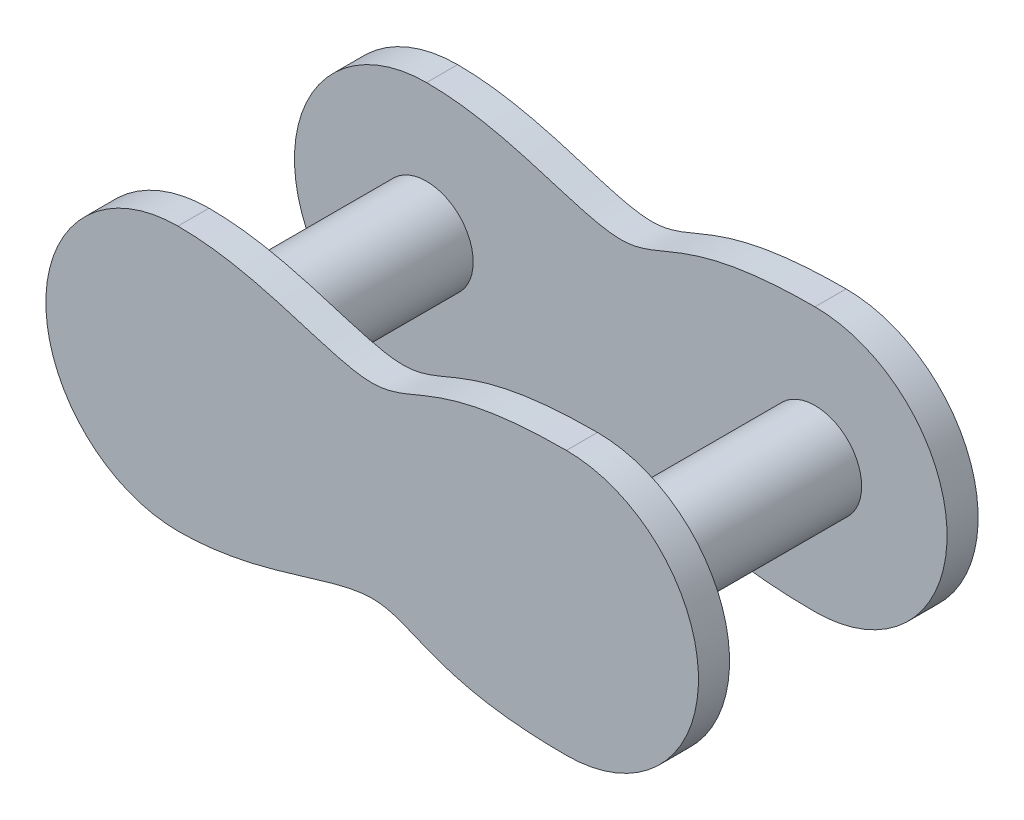
ISO-10303-21;
HEADER;
FILE_DESCRIPTION(('STEP AP214'),'2;1');
FILE_NAME('part.step','',(''),(''),'','','');
FILE_SCHEMA(('AUTOMOTIVE_DESIGN { 1 0 10303 214 1 1 1 1 }'));
ENDSEC;
DATA;
#1=APPLICATION_CONTEXT('core data for automotive mechanical design processes');
#2=APPLICATION_PROTOCOL_DEFINITION('international standard','automotive_design',2000,#1);
#3=PRODUCT_CONTEXT('',#1,'mechanical');
#4=PRODUCT('Part','Part','',(#3));
#5=PRODUCT_RELATED_PRODUCT_CATEGORY('part','',(#4));
#6=PRODUCT_DEFINITION_FORMATION('','',#4);
#7=PRODUCT_DEFINITION_CONTEXT('part definition',#1,'design');
#8=PRODUCT_DEFINITION('design','',#6,#7);
#9=PRODUCT_DEFINITION_SHAPE('','',#8);
#10=(LENGTH_UNIT() NAMED_UNIT(*) SI_UNIT(.MILLI.,.METRE.));
#11=(NAMED_UNIT(*) PLANE_ANGLE_UNIT() SI_UNIT($,.RADIAN.));
#12=(NAMED_UNIT(*) SI_UNIT($,.STERADIAN.) SOLID_ANGLE_UNIT());
#13=UNCERTAINTY_MEASURE_WITH_UNIT(LENGTH_MEASURE(1.E-05),#10,'distance_accuracy_value','');
#14=(GEOMETRIC_REPRESENTATION_CONTEXT(3) GLOBAL_UNCERTAINTY_ASSIGNED_CONTEXT((#13)) GLOBAL_UNIT_ASSIGNED_CONTEXT((#10,
#11,#12)) REPRESENTATION_CONTEXT('',''));
#15=CARTESIAN_POINT('',(0.,0.,0.));
#16=DIRECTION('',(0.,0.,1.));
#17=DIRECTION('',(1.,0.,0.));
#18=AXIS2_PLACEMENT_3D('',#15,#16,#17);
#19=CARTESIAN_POINT('',(0.,-4.25,8.));
#20=CARTESIAN_POINT('',(2.67403160960041,-4.25,8.));
#21=CARTESIAN_POINT('',(7.06388467689667,-1.75,8.));
#22=CARTESIAN_POINT('',(8.19819903660626,-4.25,8.));
#23=CARTESIAN_POINT('',(12.5,-4.25,8.));
#24=B_SPLINE_CURVE_WITH_KNOTS('',3,(#19,#20,#21,#22,#23),.UNSPECIFIED.,.F.,.F.,(4,1,4),(0.,0.5,
1.),.UNSPECIFIED.);
#25=DIRECTION('',(0.,0.,-1.));
#26=VECTOR('',#25,1.);
#27=SURFACE_OF_LINEAR_EXTRUSION('',#24,#26);
#28=CARTESIAN_POINT('',(12.4999999134409,-4.25,0.));
#29=CARTESIAN_POINT('',(12.3636301004462,-4.24999232423825,0.));
#30=CARTESIAN_POINT('',(12.2272536045244,-4.24874330770602,0.));
#31=CARTESIAN_POINT('',(11.9545972369986,-4.24345503165947,0.));
#32=CARTESIAN_POINT('',(11.8183173486259,-4.23941662013621,0.));
#33=CARTESIAN_POINT('',(11.5459929040845,-4.22824694309938,0.));
#34=CARTESIAN_POINT('',(11.4099482465797,-4.2211182159876,0.));
#35=CARTESIAN_POINT('',(11.1382408444646,-4.2034110261862,0.));
#36=CARTESIAN_POINT('',(11.0025778390135,-4.19283662232404,0.));
#37=CARTESIAN_POINT('',(10.7317818628885,-4.16783491533667,0.));
#38=CARTESIAN_POINT('',(10.5966484308667,-4.15341267352068,0.));
#39=CARTESIAN_POINT('',(10.3270644704275,-4.12025685405665,0.));
#40=CARTESIAN_POINT('',(10.1926133348081,-4.10152826025847,0.));
#41=CARTESIAN_POINT('',(9.91644655716306,-4.05796982579086,0.));
#42=CARTESIAN_POINT('',(9.77477735433815,-4.03284208109059,0.));
#43=CARTESIAN_POINT('',(9.49278253628223,-3.97654592078536,0.));
#44=CARTESIAN_POINT('',(9.35245571349389,-3.94538360339747,0.));
#45=CARTESIAN_POINT('',(9.07351017827651,-3.87646780156054,0.));
#46=CARTESIAN_POINT('',(8.93489049860773,-3.83871825243998,0.));
#47=CARTESIAN_POINT('',(8.65966126010502,-3.7563169479562,0.));
#48=CARTESIAN_POINT('',(8.52305239876407,-3.71166285665289,0.));
#49=CARTESIAN_POINT('',(8.31976721985929,-3.63988565210246,0.));
#50=CARTESIAN_POINT('',(8.25223726160284,-3.61514446645072,0.));
#51=CARTESIAN_POINT('',(8.11769943114744,-3.56428039814751,0.));
#52=CARTESIAN_POINT('',(8.05069156181523,-3.53815750791538,0.));
#53=CARTESIAN_POINT('',(7.9170969877143,-3.48486104905996,0.));
#54=CARTESIAN_POINT('',(7.85051028738603,-3.45768746938054,0.));
#55=CARTESIAN_POINT('',(7.71755731244475,-3.40280963379077,0.));
#56=CARTESIAN_POINT('',(7.65119104156175,-3.37510536895352,0.));
#57=CARTESIAN_POINT('',(7.533953601423,-3.32641129546142,0.));
#58=CARTESIAN_POINT('',(7.48310359481398,-3.30537252681239,0.));
#59=CARTESIAN_POINT('',(7.38115902146033,-3.26389939637862,0.));
#60=CARTESIAN_POINT('',(7.33006443542553,-3.24346508321167,0.));
#61=CARTESIAN_POINT('',(7.17612453516542,-3.18391841402637,0.));
#62=CARTESIAN_POINT('',(7.07255627010633,-3.14653293199643,0.));
#63=CARTESIAN_POINT('',(6.91662407182616,-3.098669748005,0.));
#64=CARTESIAN_POINT('',(6.86548106537899,-3.08427574571806,0.));
#65=CARTESIAN_POINT('',(6.76243162854059,-3.05850464600991,0.));
#66=CARTESIAN_POINT('',(6.71052523093053,-3.0471274194407,0.));
#67=CARTESIAN_POINT('',(6.60612900964241,-3.0279013710078,0.));
#68=CARTESIAN_POINT('',(6.55364008057093,-3.02004774675611,0.));
#69=CARTESIAN_POINT('',(6.44823770149158,-3.00812354573468,0.));
#70=CARTESIAN_POINT('',(6.39532432679607,-3.00405231217703,0.));
#71=CARTESIAN_POINT('',(6.30676908464718,-3.00042561992966,0.));
#72=CARTESIAN_POINT('',(6.27116623582179,-2.99982578046064,0.));
#73=CARTESIAN_POINT('',(6.19997450850061,-3.00026461198174,0.));
#74=CARTESIAN_POINT('',(6.16438562935816,-3.00130319512625,0.));
#75=CARTESIAN_POINT('',(6.05758745756266,-3.00652722240742,0.));
#76=CARTESIAN_POINT('',(5.98648115600178,-3.0128249614443,0.));
#77=CARTESIAN_POINT('',(5.84473207278868,-3.0296079687628,0.));
#78=CARTESIAN_POINT('',(5.77408979448801,-3.04009720137977,0.));
#79=CARTESIAN_POINT('',(5.63059627757794,-3.06466016462793,0.));
#80=CARTESIAN_POINT('',(5.55776669158876,-3.07885803338416,0.));
#81=CARTESIAN_POINT('',(5.41273403238581,-3.10969984085434,0.));
#82=CARTESIAN_POINT('',(5.34053028168885,-3.12634065421291,0.));
#83=CARTESIAN_POINT('',(5.19656715103356,-3.16142127679294,0.));
#84=CARTESIAN_POINT('',(5.12480776246366,-3.17986105103441,0.));
#85=CARTESIAN_POINT('',(4.90516455358354,-3.23838500216252,0.));
#86=CARTESIAN_POINT('',(4.75784104593108,-3.28055008557947,0.));
#87=CARTESIAN_POINT('',(4.46376615461495,-3.36716157864571,0.));
#88=CARTESIAN_POINT('',(4.31701529607718,-3.41160971226147,0.));
#89=CARTESIAN_POINT('',(4.02355018058861,-3.50069050268707,0.));
#90=CARTESIAN_POINT('',(3.87683592935201,-3.5453231790336,0.));
#91=CARTESIAN_POINT('',(3.58308194853134,-3.63319189823567,0.));
#92=CARTESIAN_POINT('',(3.43604246807683,-3.67642876574771,0.));
#93=CARTESIAN_POINT('',(3.14137149202704,-3.76025993578254,0.));
#94=CARTESIAN_POINT('',(2.99374077724288,-3.80085695706523,0.));
#95=CARTESIAN_POINT('',(2.69768039302882,-3.87836947661468,0.));
#96=CARTESIAN_POINT('',(2.5492517820608,-3.91528897856225,0.));
#97=CARTESIAN_POINT('',(2.2699640956898,-3.98023601868969,0.));
#98=CARTESIAN_POINT('',(2.13922998650137,-4.00879815085869,0.));
#99=CARTESIAN_POINT('',(1.87689974432029,-4.06187067488016,0.));
#100=CARTESIAN_POINT('',(1.74530339078851,-4.08637998442855,0.));
#101=CARTESIAN_POINT('',(1.48110416778914,-4.13084329624005,0.));
#102=CARTESIAN_POINT('',(1.34849995416413,-4.15078937187534,0.));
#103=CARTESIAN_POINT('',(1.08214268819312,-4.1856402746746,0.));
#104=CARTESIAN_POINT('',(0.948387222886096,-4.20052680821653,0.));
#105=CARTESIAN_POINT('',(0.679581119118752,-4.22477134298989,0.));
#106=CARTESIAN_POINT('',(0.544527477823095,-4.23409656772334,0.));
#107=CARTESIAN_POINT('',(0.272990564541401,-4.24674304586993,0.));
#108=CARTESIAN_POINT('',(0.136504905308196,-4.25001254212947,0.));
#109=CARTESIAN_POINT('',(2.84581658333766E-08,-4.25,0.));
#110=B_SPLINE_CURVE_WITH_KNOTS('',3,(#28,#29,#30,#31,#32,#33,#34,#35,#36,#37,#38,#39,#40,#41,
#42,#43,#44,#45,#46,#47,#48,#49,#50,#51,#52,#53,#54,#55,#56,#57,#58,#59,#60,#61,#62,#63,#64,#65,
#66,#67,#68,#69,#70,#71,#72,#73,#74,#75,#76,#77,#78,#79,#80,#81,#82,#83,#84,#85,#86,#87,#88,#89,
#90,#91,#92,#93,#94,#95,#96,#97,#98,#99,#100,#101,#102,#103,#104,#105,#106,#107,#108,#109),
.UNSPECIFIED.,.F.,.F.,(4,2,2,2,2,2,2,2,2,2,2,2,2,2,2,2,2,2,2,2,2,2,2,2,2,2,2,2,2,2,2,2,2,2,2,2,
2,2,2,2,4),(0.,0.409113810091478,0.818103302095372,1.22675748261345,1.63493201953431,
2.04257228280353,2.44974312734393,2.88126528428081,3.31235362237273,3.74318529693699,
4.17416305040452,4.3899081003253,4.60565433404595,4.82140283862836,5.03715497560608,
5.20224065083676,5.36733956839222,5.69731842608371,5.85663382851435,6.01594240955979,
6.1750332012315,6.33409636264026,6.44088266781832,6.54766324773982,6.76162687633046,
6.9757933535823,7.1983353126544,7.42059500684334,7.64285038015286,8.1025053833161,
8.56251273336209,9.02257009723894,9.48235048664652,9.9416495957075,10.400443075815,
10.8018413539794,11.2033466528258,11.6055441841967,12.0091808313772,12.4151734534432,
12.8246202837488),.UNSPECIFIED.);
#111=CARTESIAN_POINT('',(12.4999999134409,-4.25,0.));
#112=VERTEX_POINT('',#111);
#113=CARTESIAN_POINT('',(2.8458167660535E-08,-4.25,0.));
#114=VERTEX_POINT('',#113);
#115=EDGE_CURVE('E102',#112,#114,#110,.T.);
#116=ORIENTED_EDGE('',*,*,#115,.T.);
#117=DIRECTION('',(0.,0.,-1.));
#118=VECTOR('',#117,1.);
#119=CARTESIAN_POINT('',(0.,-4.25,-0.5));
#120=LINE('',#119,#118);
#121=CARTESIAN_POINT('',(2.8458167660535E-08,-4.25,-1.));
#122=VERTEX_POINT('',#121);
#123=EDGE_CURVE('E12',#122,#114,#120,.F.);
#124=ORIENTED_EDGE('',*,*,#123,.F.);
#125=CARTESIAN_POINT('',(12.4999999134409,-4.25,-1.));
#126=CARTESIAN_POINT('',(12.3636301004462,-4.24999232423825,-1.));
#127=CARTESIAN_POINT('',(12.2272536045244,-4.24874330770602,-1.));
#128=CARTESIAN_POINT('',(11.9545972369986,-4.24345503165947,-1.));
#129=CARTESIAN_POINT('',(11.8183173486259,-4.23941662013621,-1.));
#130=CARTESIAN_POINT('',(11.5459929040845,-4.22824694309938,-1.));
#131=CARTESIAN_POINT('',(11.4099482465797,-4.2211182159876,-1.));
#132=CARTESIAN_POINT('',(11.1382408444646,-4.2034110261862,-1.));
#133=CARTESIAN_POINT('',(11.0025778390135,-4.19283662232404,-1.));
#134=CARTESIAN_POINT('',(10.7317818628885,-4.16783491533667,-1.));
#135=CARTESIAN_POINT('',(10.5966484308667,-4.15341267352068,-1.));
#136=CARTESIAN_POINT('',(10.3270644704275,-4.12025685405665,-1.));
#137=CARTESIAN_POINT('',(10.1926133348081,-4.10152826025847,-1.));
#138=CARTESIAN_POINT('',(9.91644655716306,-4.05796982579086,-1.));
#139=CARTESIAN_POINT('',(9.77477735433815,-4.03284208109059,-1.));
#140=CARTESIAN_POINT('',(9.49278253628223,-3.97654592078536,-1.));
#141=CARTESIAN_POINT('',(9.35245571349389,-3.94538360339747,-1.));
#142=CARTESIAN_POINT('',(9.07351017827651,-3.87646780156054,-1.));
#143=CARTESIAN_POINT('',(8.93489049860773,-3.83871825243998,-1.));
#144=CARTESIAN_POINT('',(8.65966126010502,-3.7563169479562,-1.));
#145=CARTESIAN_POINT('',(8.52305239876407,-3.71166285665289,-1.));
#146=CARTESIAN_POINT('',(8.31976721985929,-3.63988565210246,-1.));
#147=CARTESIAN_POINT('',(8.25223726160284,-3.61514446645072,-1.));
#148=CARTESIAN_POINT('',(8.11769943114744,-3.56428039814751,-1.));
#149=CARTESIAN_POINT('',(8.05069156181523,-3.53815750791538,-1.));
#150=CARTESIAN_POINT('',(7.9170969877143,-3.48486104905996,-1.));
#151=CARTESIAN_POINT('',(7.85051028738603,-3.45768746938054,-1.));
#152=CARTESIAN_POINT('',(7.71755731244475,-3.40280963379077,-1.));
#153=CARTESIAN_POINT('',(7.65119104156175,-3.37510536895352,-1.));
#154=CARTESIAN_POINT('',(7.533953601423,-3.32641129546142,-1.));
#155=CARTESIAN_POINT('',(7.48310359481398,-3.30537252681239,-1.));
#156=CARTESIAN_POINT('',(7.38115902146033,-3.26389939637862,-1.));
#157=CARTESIAN_POINT('',(7.33006443542553,-3.24346508321167,-1.));
#158=CARTESIAN_POINT('',(7.17612453516542,-3.18391841402637,-1.));
#159=CARTESIAN_POINT('',(7.07255627010633,-3.14653293199643,-1.));
#160=CARTESIAN_POINT('',(6.91662407182616,-3.098669748005,-1.));
#161=CARTESIAN_POINT('',(6.86548106537899,-3.08427574571806,-1.));
#162=CARTESIAN_POINT('',(6.76243162854059,-3.05850464600991,-1.));
#163=CARTESIAN_POINT('',(6.71052523093053,-3.0471274194407,-1.));
#164=CARTESIAN_POINT('',(6.60612900964241,-3.0279013710078,-1.));
#165=CARTESIAN_POINT('',(6.55364008057093,-3.02004774675611,-1.));
#166=CARTESIAN_POINT('',(6.44823770149158,-3.00812354573468,-1.));
#167=CARTESIAN_POINT('',(6.39532432679607,-3.00405231217703,-1.));
#168=CARTESIAN_POINT('',(6.30676908464718,-3.00042561992966,-1.));
#169=CARTESIAN_POINT('',(6.27116623582179,-2.99982578046064,-1.));
#170=CARTESIAN_POINT('',(6.19997450850061,-3.00026461198174,-1.));
#171=CARTESIAN_POINT('',(6.16438562935816,-3.00130319512625,-1.));
#172=CARTESIAN_POINT('',(6.05758745756266,-3.00652722240742,-1.));
#173=CARTESIAN_POINT('',(5.98648115600178,-3.0128249614443,-1.));
#174=CARTESIAN_POINT('',(5.84473207278868,-3.0296079687628,-1.));
#175=CARTESIAN_POINT('',(5.77408979448801,-3.04009720137977,-1.));
#176=CARTESIAN_POINT('',(5.63059627757794,-3.06466016462793,-1.));
#177=CARTESIAN_POINT('',(5.55776669158876,-3.07885803338416,-1.));
#178=CARTESIAN_POINT('',(5.41273403238581,-3.10969984085434,-1.));
#179=CARTESIAN_POINT('',(5.34053028168885,-3.12634065421291,-1.));
#180=CARTESIAN_POINT('',(5.19656715103356,-3.16142127679294,-1.));
#181=CARTESIAN_POINT('',(5.12480776246366,-3.17986105103441,-1.));
#182=CARTESIAN_POINT('',(4.90516455358354,-3.23838500216252,-1.));
#183=CARTESIAN_POINT('',(4.75784104593108,-3.28055008557947,-1.));
#184=CARTESIAN_POINT('',(4.46376615461495,-3.36716157864571,-1.));
#185=CARTESIAN_POINT('',(4.31701529607718,-3.41160971226147,-1.));
#186=CARTESIAN_POINT('',(4.02355018058861,-3.50069050268707,-1.));
#187=CARTESIAN_POINT('',(3.87683592935201,-3.5453231790336,-1.));
#188=CARTESIAN_POINT('',(3.58308194853134,-3.63319189823567,-1.));
#189=CARTESIAN_POINT('',(3.43604246807683,-3.67642876574771,-1.));
#190=CARTESIAN_POINT('',(3.14137149202704,-3.76025993578254,-1.));
#191=CARTESIAN_POINT('',(2.99374077724288,-3.80085695706523,-1.));
#192=CARTESIAN_POINT('',(2.69768039302882,-3.87836947661468,-1.));
#193=CARTESIAN_POINT('',(2.5492517820608,-3.91528897856225,-1.));
#194=CARTESIAN_POINT('',(2.2699640956898,-3.98023601868969,-1.));
#195=CARTESIAN_POINT('',(2.13922998650137,-4.00879815085869,-1.));
#196=CARTESIAN_POINT('',(1.87689974432029,-4.06187067488016,-1.));
#197=CARTESIAN_POINT('',(1.74530339078851,-4.08637998442855,-1.));
#198=CARTESIAN_POINT('',(1.48110416778914,-4.13084329624005,-1.));
#199=CARTESIAN_POINT('',(1.34849995416413,-4.15078937187534,-1.));
#200=CARTESIAN_POINT('',(1.08214268819312,-4.1856402746746,-1.));
#201=CARTESIAN_POINT('',(0.948387222886096,-4.20052680821653,-1.));
#202=CARTESIAN_POINT('',(0.679581119118752,-4.22477134298989,-1.));
#203=CARTESIAN_POINT('',(0.544527477823095,-4.23409656772334,-1.));
#204=CARTESIAN_POINT('',(0.272990564541401,-4.24674304586993,-1.));
#205=CARTESIAN_POINT('',(0.136504905308196,-4.25001254212947,-1.));
#206=CARTESIAN_POINT('',(2.84581658333766E-08,-4.25,-1.));
#207=B_SPLINE_CURVE_WITH_KNOTS('',3,(#125,#126,#127,#128,#129,#130,#131,#132,#133,#134,#135,
#136,#137,#138,#139,#140,#141,#142,#143,#144,#145,#146,#147,#148,#149,#150,#151,#152,#153,#154,
#155,#156,#157,#158,#159,#160,#161,#162,#163,#164,#165,#166,#167,#168,#169,#170,#171,#172,#173,
#174,#175,#176,#177,#178,#179,#180,#181,#182,#183,#184,#185,#186,#187,#188,#189,#190,#191,#192,
#193,#194,#195,#196,#197,#198,#199,#200,#201,#202,#203,#204,#205,#206),.UNSPECIFIED.,.F.,.F.,(4,
2,2,2,2,2,2,2,2,2,2,2,2,2,2,2,2,2,2,2,2,2,2,2,2,2,2,2,2,2,2,2,2,2,2,2,2,2,2,2,4),(0.,
0.409113810091478,0.818103302095372,1.22675748261345,1.63493201953431,2.04257228280353,
2.44974312734393,2.88126528428081,3.31235362237273,3.74318529693699,4.17416305040452,
4.3899081003253,4.60565433404595,4.82140283862836,5.03715497560608,5.20224065083676,
5.36733956839222,5.69731842608371,5.85663382851435,6.01594240955979,6.1750332012315,
6.33409636264026,6.44088266781832,6.54766324773982,6.76162687633046,6.9757933535823,
7.1983353126544,7.42059500684334,7.64285038015286,8.1025053833161,8.56251273336209,
9.02257009723894,9.48235048664652,9.9416495957075,10.400443075815,10.8018413539794,
11.2033466528258,11.6055441841967,12.0091808313772,12.4151734534432,12.8246202837488),.UNSPECIFIED.);
#208=CARTESIAN_POINT('',(12.4999999134409,-4.25,-1.));
#209=VERTEX_POINT('',#208);
#210=EDGE_CURVE('E153',#209,#122,#207,.T.);
#211=ORIENTED_EDGE('',*,*,#210,.F.);
#212=DIRECTION('',(0.,0.,-1.));
#213=VECTOR('',#212,1.);
#214=CARTESIAN_POINT('',(12.5,-4.25,-0.5));
#215=LINE('',#214,#213);
#216=EDGE_CURVE('E108',#209,#112,#215,.F.);
#217=ORIENTED_EDGE('',*,*,#216,.T.);
#218=EDGE_LOOP('',(#116,#124,#211,#217));
#219=FACE_BOUND('',#218,.T.);
#220=ADVANCED_FACE('F48',(#219),#27,.F.);
#221=CARTESIAN_POINT('',(0.,0.,-1.));
#222=DIRECTION('',(0.,0.,1.));
#223=DIRECTION('',(1.,0.,0.));
#224=AXIS2_PLACEMENT_3D('',#221,#222,#223);
#225=CYLINDRICAL_SURFACE('',#224,4.25);
#226=CARTESIAN_POINT('',(0.,0.,0.));
#227=DIRECTION('',(0.,0.,-1.));
#228=DIRECTION('',(-1.,0.,0.));
#229=AXIS2_PLACEMENT_3D('',#226,#227,#228);
#230=CIRCLE('',#229,4.25);
#231=CARTESIAN_POINT('',(2.89917164085339E-08,4.25,0.));
#232=VERTEX_POINT('',#231);
#233=EDGE_CURVE('E97',#114,#232,#230,.T.);
#234=ORIENTED_EDGE('',*,*,#233,.T.);
#235=DIRECTION('',(0.,0.,-1.));
#236=VECTOR('',#235,1.);
#237=CARTESIAN_POINT('',(0.,4.25,-0.5));
#238=LINE('',#237,#236);
#239=CARTESIAN_POINT('',(2.89917164085339E-08,4.25,-1.));
#240=VERTEX_POINT('',#239);
#241=EDGE_CURVE('E58',#240,#232,#238,.F.);
#242=ORIENTED_EDGE('',*,*,#241,.F.);
#243=CARTESIAN_POINT('',(0.,0.,-1.));
#244=DIRECTION('',(0.,0.,-1.));
#245=DIRECTION('',(-1.,0.,0.));
#246=AXIS2_PLACEMENT_3D('',#243,#244,#245);
#247=CIRCLE('',#246,4.25);
#248=EDGE_CURVE('E78',#122,#240,#247,.T.);
#249=ORIENTED_EDGE('',*,*,#248,.F.);
#250=ORIENTED_EDGE('',*,*,#123,.T.);
#251=EDGE_LOOP('',(#234,#242,#249,#250));
#252=FACE_BOUND('',#251,.T.);
#253=ADVANCED_FACE('F105',(#252),#225,.T.);
#254=CARTESIAN_POINT('',(12.5,4.25,8.));
#255=CARTESIAN_POINT('',(8.19819903660626,4.25,8.));
#256=CARTESIAN_POINT('',(7.06388467689667,1.75,8.));
#257=CARTESIAN_POINT('',(2.67403160960041,4.25,8.));
#258=CARTESIAN_POINT('',(0.,4.25,8.));
#259=B_SPLINE_CURVE_WITH_KNOTS('',3,(#254,#255,#256,#257,#258),.UNSPECIFIED.,.F.,.F.,(4,1,4),
(0.,0.5,1.),.UNSPECIFIED.);
#260=DIRECTION('',(0.,0.,-1.));
#261=VECTOR('',#260,1.);
#262=SURFACE_OF_LINEAR_EXTRUSION('',#259,#261);
#263=CARTESIAN_POINT('',(2.89917164085339E-08,4.25,0.));
#264=CARTESIAN_POINT('',(0.101581072706863,4.25000404812745,0.));
#265=CARTESIAN_POINT('',(0.203156435155407,4.24819629561662,0.));
#266=CARTESIAN_POINT('',(0.40604381842267,4.24111915327701,0.));
#267=CARTESIAN_POINT('',(0.507356008578995,4.23585465274116,0.));
#268=CARTESIAN_POINT('',(0.70967670754809,4.22203027098814,0.));
#269=CARTESIAN_POINT('',(0.810685386854615,4.21347285819732,0.));
#270=CARTESIAN_POINT('',(1.01236415303549,4.19324624683376,0.));
#271=CARTESIAN_POINT('',(1.11303431642694,4.1815778071222,0.));
#272=CARTESIAN_POINT('',(1.31400105805777,4.15532340984079,0.));
#273=CARTESIAN_POINT('',(1.4142976004219,4.14073717910243,0.));
#274=CARTESIAN_POINT('',(1.61737814831203,4.1083942867458,0.));
#275=CARTESIAN_POINT('',(1.72014935084888,4.09055754039202,0.));
#276=CARTESIAN_POINT('',(1.92520904242339,4.05226194750446,0.));
#277=CARTESIAN_POINT('',(2.02749748885827,4.03180287387853,0.));
#278=CARTESIAN_POINT('',(2.23154887206164,3.98852810712791,0.));
#279=CARTESIAN_POINT('',(2.33331192055123,3.96571293866957,0.));
#280=CARTESIAN_POINT('',(2.53627438612803,3.91801337566951,0.));
#281=CARTESIAN_POINT('',(2.63747414930829,3.89313044783063,0.));
#282=CARTESIAN_POINT('',(2.83927750707232,3.84160780687475,0.));
#283=CARTESIAN_POINT('',(2.93988172384415,3.81497052093549,0.));
#284=CARTESIAN_POINT('',(3.13969042227992,3.76049299729397,0.));
#285=CARTESIAN_POINT('',(3.23889888909882,3.73266731449677,0.));
#286=CARTESIAN_POINT('',(3.43696880265588,3.67590997544751,0.));
#287=CARTESIAN_POINT('',(3.53583033521353,3.64697861737996,0.));
#288=CARTESIAN_POINT('',(3.73349883281807,3.58832455272471,0.));
#289=CARTESIAN_POINT('',(3.83230542421815,3.55860059305063,0.));
#290=CARTESIAN_POINT('',(4.03017326287492,3.4987318728004,0.));
#291=CARTESIAN_POINT('',(4.12923416947971,3.46858599322607,0.));
#292=CARTESIAN_POINT('',(4.32794710374696,3.4083334433161,0.));
#293=CARTESIAN_POINT('',(4.4275994592323,3.37822784506315,0.));
#294=CARTESIAN_POINT('',(4.62247764625451,3.32026434651977,0.));
#295=CARTESIAN_POINT('',(4.71769174114512,3.29236726668268,0.));
#296=CARTESIAN_POINT('',(4.90855734131068,3.23807440166353,0.));
#297=CARTESIAN_POINT('',(5.00420886734777,3.21167868855809,0.));
#298=CARTESIAN_POINT('',(5.19565048829431,3.16149660251719,0.));
#299=CARTESIAN_POINT('',(5.29143706079034,3.1376969387501,0.));
#300=CARTESIAN_POINT('',(5.48293761366297,3.09408303386702,0.));
#301=CARTESIAN_POINT('',(5.5786427553715,3.07423134528907,0.));
#302=CARTESIAN_POINT('',(5.72232869151765,3.04875643163486,0.));
#303=CARTESIAN_POINT('',(5.76993255060413,3.04101891688062,0.));
#304=CARTESIAN_POINT('',(5.86541771999006,3.02721727675101,0.));
#305=CARTESIAN_POINT('',(5.91329919463934,3.02115427465597,0.));
#306=CARTESIAN_POINT('',(6.01983157396083,3.00995501338293,0.));
#307=CARTESIAN_POINT('',(6.07853721151123,3.00531506634463,0.));
#308=CARTESIAN_POINT('',(6.19613160573958,2.99996474038109,0.));
#309=CARTESIAN_POINT('',(6.25502030544678,2.99925324166197,0.));
#310=CARTESIAN_POINT('',(6.3726077808798,3.00253933610252,0.));
#311=CARTESIAN_POINT('',(6.43130669786666,3.00653145084027,0.));
#312=CARTESIAN_POINT('',(6.54856740965518,3.01920598372093,0.));
#313=CARTESIAN_POINT('',(6.60712596460732,3.02791803607346,0.));
#314=CARTESIAN_POINT('',(6.72349155221994,3.04970416793846,0.));
#315=CARTESIAN_POINT('',(6.78129752183419,3.0627838413815,0.));
#316=CARTESIAN_POINT('',(6.89597488864239,3.09258326492739,0.));
#317=CARTESIAN_POINT('',(6.95284582572202,3.10930475266159,0.));
#318=CARTESIAN_POINT('',(7.06655882649615,3.14577113212475,0.));
#319=CARTESIAN_POINT('',(7.12338701775636,3.16555853435366,0.));
#320=CARTESIAN_POINT('',(7.23630484882378,3.20701544279808,0.));
#321=CARTESIAN_POINT('',(7.29239488920089,3.22868387527077,0.));
#322=CARTESIAN_POINT('',(7.40414717343555,3.27309564501361,0.));
#323=CARTESIAN_POINT('',(7.45980938554567,3.2958390611756,0.));
#324=CARTESIAN_POINT('',(7.60204173786632,3.35453985698237,0.));
#325=CARTESIAN_POINT('',(7.68849527739085,3.3907766648204,0.));
#326=CARTESIAN_POINT('',(7.8617621277703,3.46236580316063,0.));
#327=CARTESIAN_POINT('',(7.9485754004348,3.49771822488304,0.));
#328=CARTESIAN_POINT('',(8.12204713000489,3.56608083615576,0.));
#329=CARTESIAN_POINT('',(8.20869718267628,3.59911215264612,0.));
#330=CARTESIAN_POINT('',(8.38292168842657,3.66266003607043,0.));
#331=CARTESIAN_POINT('',(8.47049617051255,3.69317652382695,0.));
#332=CARTESIAN_POINT('',(8.64620122114943,3.75130444543416,0.));
#333=CARTESIAN_POINT('',(8.73432795742136,3.77892744328033,0.));
#334=CARTESIAN_POINT('',(8.91141857658214,3.83134670521596,0.));
#335=CARTESIAN_POINT('',(9.00038247246449,3.85614292535264,0.));
#336=CARTESIAN_POINT('',(9.20055533945356,3.90859859405758,0.));
#337=CARTESIAN_POINT('',(9.3119609630461,3.93550908144375,0.));
#338=CARTESIAN_POINT('',(9.5361798849047,3.98540710343184,0.));
#339=CARTESIAN_POINT('',(9.64899730104782,4.0083760239343,0.));
#340=CARTESIAN_POINT('',(9.8757673116101,4.05063287940242,0.));
#341=CARTESIAN_POINT('',(9.98972260883701,4.06990623491177,0.));
#342=CARTESIAN_POINT('',(10.2184900381768,4.10504067539925,0.));
#343=CARTESIAN_POINT('',(10.3333036922446,4.12089178262986,0.));
#344=CARTESIAN_POINT('',(10.5635093644875,4.1494549420218,0.));
#345=CARTESIAN_POINT('',(10.6789020228636,4.16216179579136,0.));
#346=CARTESIAN_POINT('',(10.9086428013721,4.1845706014497,0.));
#347=CARTESIAN_POINT('',(11.022987757442,4.19430528636114,0.));
#348=CARTESIAN_POINT('',(11.251667231264,4.21120894480046,0.));
#349=CARTESIAN_POINT('',(11.3660014275822,4.21838230988516,0.));
#350=CARTESIAN_POINT('',(11.5943543770335,4.23039376877433,0.));
#351=CARTESIAN_POINT('',(11.7083726731844,4.23524065227862,0.));
#352=CARTESIAN_POINT('',(11.9357884983878,4.24281995915705,0.));
#353=CARTESIAN_POINT('',(12.049185616934,4.24556497805276,0.));
#354=CARTESIAN_POINT('',(12.2750563100829,4.24914531788445,0.));
#355=CARTESIAN_POINT('',(12.3875296293819,4.24999650891446,0.));
#356=CARTESIAN_POINT('',(12.4999999608568,4.25,0.));
#357=B_SPLINE_CURVE_WITH_KNOTS('',3,(#263,#264,#265,#266,#267,#268,#269,#270,#271,#272,#273,
#274,#275,#276,#277,#278,#279,#280,#281,#282,#283,#284,#285,#286,#287,#288,#289,#290,#291,#292,
#293,#294,#295,#296,#297,#298,#299,#300,#301,#302,#303,#304,#305,#306,#307,#308,#309,#310,#311,
#312,#313,#314,#315,#316,#317,#318,#319,#320,#321,#322,#323,#324,#325,#326,#327,#328,#329,#330,
#331,#332,#333,#334,#335,#336,#337,#338,#339,#340,#341,#342,#343,#344,#345,#346,#347,#348,#349,
#350,#351,#352,#353,#354,#355,#356),.UNSPECIFIED.,.F.,.F.,(4,2,2,2,2,2,2,2,2,2,2,2,2,2,2,2,2,2,
2,2,2,2,2,2,2,2,2,2,2,2,2,2,2,2,2,2,2,2,2,2,2,2,2,2,2,2,4),(0.,0.304718613606855,
0.60900715291009,0.913068035003002,1.21705481640876,1.52107007089976,1.83395535471366,
2.14686775255878,2.45971061923657,2.77233344401613,3.08453248526925,3.39363444997778,
3.70265363463067,4.01219432136936,4.32283351040931,4.63513415779832,4.93277875220753,
5.23043762370156,5.52649296670083,5.81959001684737,5.96425184258243,6.10901047455722,
6.28557488344375,6.46208896051047,6.63839765007317,6.81582634651643,6.99348316603903,
7.17122493800112,7.35169796445594,7.5320686410581,7.71245257547434,7.99367544129211,
8.27486917970582,8.55303415389764,8.83120788255464,9.10822366588184,9.38524375586361,
9.72898940237833,10.0743162039241,10.4209785287577,10.7686383110206,11.116869095126,
11.4611135610551,11.8047649296945,12.1471075222195,12.4873821982293,12.8247944914944),.UNSPECIFIED.);
#358=CARTESIAN_POINT('',(12.4999999608568,4.25,0.));
#359=VERTEX_POINT('',#358);
#360=EDGE_CURVE('E93',#232,#359,#357,.T.);
#361=ORIENTED_EDGE('',*,*,#360,.T.);
#362=DIRECTION('',(0.,0.,-1.));
#363=VECTOR('',#362,1.);
#364=CARTESIAN_POINT('',(12.5,4.25,-0.5));
#365=LINE('',#364,#363);
#366=CARTESIAN_POINT('',(12.4999999608568,4.25,-1.));
#367=VERTEX_POINT('',#366);
#368=EDGE_CURVE('E116',#367,#359,#365,.F.);
#369=ORIENTED_EDGE('',*,*,#368,.F.);
#370=CARTESIAN_POINT('',(2.89917164085339E-08,4.25,-1.));
#371=CARTESIAN_POINT('',(0.101581072706863,4.25000404812745,-1.));
#372=CARTESIAN_POINT('',(0.203156435155407,4.24819629561662,-1.));
#373=CARTESIAN_POINT('',(0.40604381842267,4.24111915327701,-1.));
#374=CARTESIAN_POINT('',(0.507356008578995,4.23585465274116,-1.));
#375=CARTESIAN_POINT('',(0.70967670754809,4.22203027098814,-1.));
#376=CARTESIAN_POINT('',(0.810685386854615,4.21347285819732,-1.));
#377=CARTESIAN_POINT('',(1.01236415303549,4.19324624683376,-1.));
#378=CARTESIAN_POINT('',(1.11303431642694,4.1815778071222,-1.));
#379=CARTESIAN_POINT('',(1.31400105805777,4.15532340984079,-1.));
#380=CARTESIAN_POINT('',(1.4142976004219,4.14073717910243,-1.));
#381=CARTESIAN_POINT('',(1.61737814831203,4.1083942867458,-1.));
#382=CARTESIAN_POINT('',(1.72014935084888,4.09055754039202,-1.));
#383=CARTESIAN_POINT('',(1.92520904242339,4.05226194750446,-1.));
#384=CARTESIAN_POINT('',(2.02749748885827,4.03180287387853,-1.));
#385=CARTESIAN_POINT('',(2.23154887206164,3.98852810712791,-1.));
#386=CARTESIAN_POINT('',(2.33331192055123,3.96571293866957,-1.));
#387=CARTESIAN_POINT('',(2.53627438612803,3.91801337566951,-1.));
#388=CARTESIAN_POINT('',(2.63747414930829,3.89313044783063,-1.));
#389=CARTESIAN_POINT('',(2.83927750707232,3.84160780687475,-1.));
#390=CARTESIAN_POINT('',(2.93988172384415,3.81497052093549,-1.));
#391=CARTESIAN_POINT('',(3.13969042227992,3.76049299729397,-1.));
#392=CARTESIAN_POINT('',(3.23889888909882,3.73266731449677,-1.));
#393=CARTESIAN_POINT('',(3.43696880265588,3.67590997544751,-1.));
#394=CARTESIAN_POINT('',(3.53583033521353,3.64697861737996,-1.));
#395=CARTESIAN_POINT('',(3.73349883281807,3.58832455272471,-1.));
#396=CARTESIAN_POINT('',(3.83230542421815,3.55860059305063,-1.));
#397=CARTESIAN_POINT('',(4.03017326287492,3.4987318728004,-1.));
#398=CARTESIAN_POINT('',(4.12923416947971,3.46858599322607,-1.));
#399=CARTESIAN_POINT('',(4.32794710374696,3.4083334433161,-1.));
#400=CARTESIAN_POINT('',(4.4275994592323,3.37822784506315,-1.));
#401=CARTESIAN_POINT('',(4.62247764625451,3.32026434651977,-1.));
#402=CARTESIAN_POINT('',(4.71769174114512,3.29236726668268,-1.));
#403=CARTESIAN_POINT('',(4.90855734131068,3.23807440166353,-1.));
#404=CARTESIAN_POINT('',(5.00420886734777,3.21167868855809,-1.));
#405=CARTESIAN_POINT('',(5.19565048829431,3.16149660251719,-1.));
#406=CARTESIAN_POINT('',(5.29143706079034,3.1376969387501,-1.));
#407=CARTESIAN_POINT('',(5.48293761366297,3.09408303386702,-1.));
#408=CARTESIAN_POINT('',(5.5786427553715,3.07423134528907,-1.));
#409=CARTESIAN_POINT('',(5.72232869151765,3.04875643163486,-1.));
#410=CARTESIAN_POINT('',(5.76993255060413,3.04101891688062,-1.));
#411=CARTESIAN_POINT('',(5.86541771999006,3.02721727675101,-1.));
#412=CARTESIAN_POINT('',(5.91329919463934,3.02115427465597,-1.));
#413=CARTESIAN_POINT('',(6.01983157396083,3.00995501338293,-1.));
#414=CARTESIAN_POINT('',(6.07853721151123,3.00531506634463,-1.));
#415=CARTESIAN_POINT('',(6.19613160573958,2.99996474038109,-1.));
#416=CARTESIAN_POINT('',(6.25502030544678,2.99925324166197,-1.));
#417=CARTESIAN_POINT('',(6.3726077808798,3.00253933610252,-1.));
#418=CARTESIAN_POINT('',(6.43130669786666,3.00653145084027,-1.));
#419=CARTESIAN_POINT('',(6.54856740965518,3.01920598372093,-1.));
#420=CARTESIAN_POINT('',(6.60712596460732,3.02791803607346,-1.));
#421=CARTESIAN_POINT('',(6.72349155221994,3.04970416793846,-1.));
#422=CARTESIAN_POINT('',(6.78129752183419,3.0627838413815,-1.));
#423=CARTESIAN_POINT('',(6.89597488864239,3.09258326492739,-1.));
#424=CARTESIAN_POINT('',(6.95284582572202,3.10930475266159,-1.));
#425=CARTESIAN_POINT('',(7.06655882649615,3.14577113212475,-1.));
#426=CARTESIAN_POINT('',(7.12338701775636,3.16555853435366,-1.));
#427=CARTESIAN_POINT('',(7.23630484882378,3.20701544279808,-1.));
#428=CARTESIAN_POINT('',(7.29239488920089,3.22868387527077,-1.));
#429=CARTESIAN_POINT('',(7.40414717343555,3.27309564501361,-1.));
#430=CARTESIAN_POINT('',(7.45980938554567,3.2958390611756,-1.));
#431=CARTESIAN_POINT('',(7.60204173786632,3.35453985698237,-1.));
#432=CARTESIAN_POINT('',(7.68849527739085,3.3907766648204,-1.));
#433=CARTESIAN_POINT('',(7.8617621277703,3.46236580316063,-1.));
#434=CARTESIAN_POINT('',(7.9485754004348,3.49771822488304,-1.));
#435=CARTESIAN_POINT('',(8.12204713000489,3.56608083615576,-1.));
#436=CARTESIAN_POINT('',(8.20869718267628,3.59911215264612,-1.));
#437=CARTESIAN_POINT('',(8.38292168842657,3.66266003607043,-1.));
#438=CARTESIAN_POINT('',(8.47049617051255,3.69317652382695,-1.));
#439=CARTESIAN_POINT('',(8.64620122114943,3.75130444543416,-1.));
#440=CARTESIAN_POINT('',(8.73432795742136,3.77892744328033,-1.));
#441=CARTESIAN_POINT('',(8.91141857658214,3.83134670521596,-1.));
#442=CARTESIAN_POINT('',(9.00038247246449,3.85614292535264,-1.));
#443=CARTESIAN_POINT('',(9.20055533945356,3.90859859405758,-1.));
#444=CARTESIAN_POINT('',(9.3119609630461,3.93550908144375,-1.));
#445=CARTESIAN_POINT('',(9.5361798849047,3.98540710343184,-1.));
#446=CARTESIAN_POINT('',(9.64899730104782,4.0083760239343,-1.));
#447=CARTESIAN_POINT('',(9.8757673116101,4.05063287940242,-1.));
#448=CARTESIAN_POINT('',(9.98972260883701,4.06990623491177,-1.));
#449=CARTESIAN_POINT('',(10.2184900381768,4.10504067539925,-1.));
#450=CARTESIAN_POINT('',(10.3333036922446,4.12089178262986,-1.));
#451=CARTESIAN_POINT('',(10.5635093644875,4.1494549420218,-1.));
#452=CARTESIAN_POINT('',(10.6789020228636,4.16216179579136,-1.));
#453=CARTESIAN_POINT('',(10.9086428013721,4.1845706014497,-1.));
#454=CARTESIAN_POINT('',(11.022987757442,4.19430528636114,-1.));
#455=CARTESIAN_POINT('',(11.251667231264,4.21120894480046,-1.));
#456=CARTESIAN_POINT('',(11.3660014275822,4.21838230988516,-1.));
#457=CARTESIAN_POINT('',(11.5943543770335,4.23039376877433,-1.));
#458=CARTESIAN_POINT('',(11.7083726731844,4.23524065227862,-1.));
#459=CARTESIAN_POINT('',(11.9357884983878,4.24281995915705,-1.));
#460=CARTESIAN_POINT('',(12.049185616934,4.24556497805276,-1.));
#461=CARTESIAN_POINT('',(12.2750563100829,4.24914531788445,-1.));
#462=CARTESIAN_POINT('',(12.3875296293819,4.24999650891446,-1.));
#463=CARTESIAN_POINT('',(12.4999999608568,4.25,-1.));
#464=B_SPLINE_CURVE_WITH_KNOTS('',3,(#370,#371,#372,#373,#374,#375,#376,#377,#378,#379,#380,
#381,#382,#383,#384,#385,#386,#387,#388,#389,#390,#391,#392,#393,#394,#395,#396,#397,#398,#399,
#400,#401,#402,#403,#404,#405,#406,#407,#408,#409,#410,#411,#412,#413,#414,#415,#416,#417,#418,
#419,#420,#421,#422,#423,#424,#425,#426,#427,#428,#429,#430,#431,#432,#433,#434,#435,#436,#437,
#438,#439,#440,#441,#442,#443,#444,#445,#446,#447,#448,#449,#450,#451,#452,#453,#454,#455,#456,
#457,#458,#459,#460,#461,#462,#463),.UNSPECIFIED.,.F.,.F.,(4,2,2,2,2,2,2,2,2,2,2,2,2,2,2,2,2,2,
2,2,2,2,2,2,2,2,2,2,2,2,2,2,2,2,2,2,2,2,2,2,2,2,2,2,2,2,4),(0.,0.304718613606855,
0.60900715291009,0.913068035003002,1.21705481640876,1.52107007089976,1.83395535471366,
2.14686775255878,2.45971061923657,2.77233344401613,3.08453248526925,3.39363444997778,
3.70265363463067,4.01219432136936,4.32283351040931,4.63513415779832,4.93277875220753,
5.23043762370156,5.52649296670083,5.81959001684737,5.96425184258243,6.10901047455722,
6.28557488344375,6.46208896051047,6.63839765007317,6.81582634651643,6.99348316603903,
7.17122493800112,7.35169796445594,7.5320686410581,7.71245257547434,7.99367544129211,
8.27486917970582,8.55303415389764,8.83120788255464,9.10822366588184,9.38524375586361,
9.72898940237833,10.0743162039241,10.4209785287577,10.7686383110206,11.116869095126,
11.4611135610551,11.8047649296945,12.1471075222195,12.4873821982293,12.8247944914944),.UNSPECIFIED.);
#465=EDGE_CURVE('E146',#240,#367,#464,.T.);
#466=ORIENTED_EDGE('',*,*,#465,.F.);
#467=ORIENTED_EDGE('',*,*,#241,.T.);
#468=EDGE_LOOP('',(#361,#369,#466,#467));
#469=FACE_BOUND('',#468,.T.);
#470=ADVANCED_FACE('F142',(#469),#262,.F.);
#471=CARTESIAN_POINT('',(12.5,0.,-1.));
#472=DIRECTION('',(0.,0.,1.));
#473=DIRECTION('',(1.,0.,0.));
#474=AXIS2_PLACEMENT_3D('',#471,#472,#473);
#475=CYLINDRICAL_SURFACE('',#474,4.25);
#476=CARTESIAN_POINT('',(12.5,0.,0.));
#477=DIRECTION('',(0.,0.,-1.));
#478=DIRECTION('',(-1.,0.,0.));
#479=AXIS2_PLACEMENT_3D('',#476,#477,#478);
#480=CIRCLE('',#479,4.25);
#481=EDGE_CURVE('E85',#359,#112,#480,.T.);
#482=ORIENTED_EDGE('',*,*,#481,.T.);
#483=ORIENTED_EDGE('',*,*,#216,.F.);
#484=CARTESIAN_POINT('',(12.5,0.,-1.));
#485=DIRECTION('',(0.,0.,-1.));
#486=DIRECTION('',(-1.,0.,0.));
#487=AXIS2_PLACEMENT_3D('',#484,#485,#486);
#488=CIRCLE('',#487,4.25);
#489=EDGE_CURVE('E66',#367,#209,#488,.T.);
#490=ORIENTED_EDGE('',*,*,#489,.F.);
#491=ORIENTED_EDGE('',*,*,#368,.T.);
#492=EDGE_LOOP('',(#482,#483,#490,#491));
#493=FACE_BOUND('',#492,.T.);
#494=ADVANCED_FACE('F128',(#493),#475,.T.);
#495=CARTESIAN_POINT('',(6.25,-3.,-1.));
#496=DIRECTION('',(0.,0.,-1.));
#497=DIRECTION('',(-1.,0.,0.));
#498=AXIS2_PLACEMENT_3D('',#495,#496,#497);
#499=PLANE('',#498);
#500=ORIENTED_EDGE('',*,*,#210,.T.);
#501=ORIENTED_EDGE('',*,*,#248,.T.);
#502=ORIENTED_EDGE('',*,*,#465,.T.);
#503=ORIENTED_EDGE('',*,*,#489,.T.);
#504=EDGE_LOOP('',(#500,#501,#502,#503));
#505=FACE_BOUND('',#504,.T.);
#506=ADVANCED_FACE('F126',(#505),#499,.T.);
#507=CARTESIAN_POINT('',(6.25,-3.,0.));
#508=DIRECTION('',(0.,0.,-1.));
#509=DIRECTION('',(-1.,0.,0.));
#510=AXIS2_PLACEMENT_3D('',#507,#508,#509);
#511=PLANE('',#510);
#512=ORIENTED_EDGE('',*,*,#115,.F.);
#513=ORIENTED_EDGE('',*,*,#481,.F.);
#514=ORIENTED_EDGE('',*,*,#360,.F.);
#515=ORIENTED_EDGE('',*,*,#233,.F.);
#516=EDGE_LOOP('',(#512,#513,#514,#515));
#517=FACE_BOUND('',#516,.T.);
#518=ADVANCED_FACE('F100',(#517),#511,.F.);
#519=CLOSED_SHELL('',(#220,#253,#470,#494,#506,#518));
#520=MANIFOLD_SOLID_BREP('B2',#519);
#521=CARTESIAN_POINT('',(0.,0.,7.));
#522=DIRECTION('',(0.,0.,-1.));
#523=DIRECTION('',(-1.,0.,0.));
#524=AXIS2_PLACEMENT_3D('',#521,#522,#523);
#525=CYLINDRICAL_SURFACE('',#524,1.5);
#526=CARTESIAN_POINT('',(0.,0.,7.));
#527=DIRECTION('',(0.,0.,1.));
#528=DIRECTION('',(1.,0.,0.));
#529=AXIS2_PLACEMENT_3D('',#526,#527,#528);
#530=CIRCLE('',#529,1.5);
#531=CARTESIAN_POINT('',(1.5,0.,7.));
#532=VERTEX_POINT('',#531);
#533=EDGE_CURVE('E46',#532,#532,#530,.T.);
#534=ORIENTED_EDGE('',*,*,#533,.F.);
#535=EDGE_LOOP('',(#534));
#536=FACE_BOUND('',#535,.T.);
#537=CARTESIAN_POINT('',(0.,0.,0.));
#538=DIRECTION('',(0.,0.,1.));
#539=DIRECTION('',(1.,0.,0.));
#540=AXIS2_PLACEMENT_3D('',#537,#538,#539);
#541=CIRCLE('',#540,1.5);
#542=CARTESIAN_POINT('',(1.5,0.,0.));
#543=VERTEX_POINT('',#542);
#544=EDGE_CURVE('E212',#543,#543,#541,.T.);
#545=ORIENTED_EDGE('',*,*,#544,.T.);
#546=EDGE_LOOP('',(#545));
#547=FACE_BOUND('',#546,.T.);
#548=ADVANCED_FACE('F209',(#536,#547),#525,.T.);
#549=CARTESIAN_POINT('',(0.,0.,0.));
#550=DIRECTION('',(0.,0.,1.));
#551=DIRECTION('',(1.,0.,0.));
#552=AXIS2_PLACEMENT_3D('',#549,#550,#551);
#553=PLANE('',#552);
#554=ORIENTED_EDGE('',*,*,#544,.F.);
#555=EDGE_LOOP('',(#554));
#556=FACE_BOUND('',#555,.T.);
#557=ADVANCED_FACE('F292',(#556),#553,.F.);
#558=CARTESIAN_POINT('',(0.,-4.25,8.));
#559=CARTESIAN_POINT('',(2.67403160960041,-4.25,8.));
#560=CARTESIAN_POINT('',(7.06388467689667,-1.75,8.));
#561=CARTESIAN_POINT('',(8.19819903660626,-4.25,8.));
#562=CARTESIAN_POINT('',(12.5,-4.25,8.));
#563=B_SPLINE_CURVE_WITH_KNOTS('',3,(#558,#559,#560,#561,#562),.UNSPECIFIED.,.F.,.F.,(4,1,4),
(0.,0.5,1.),.UNSPECIFIED.);
#564=DIRECTION('',(0.,0.,-1.));
#565=VECTOR('',#564,1.);
#566=SURFACE_OF_LINEAR_EXTRUSION('',#563,#565);
#567=CARTESIAN_POINT('',(0.,-4.25,7.));
#568=CARTESIAN_POINT('',(2.67403160960041,-4.25,7.));
#569=CARTESIAN_POINT('',(7.06388467689667,-1.75,7.));
#570=CARTESIAN_POINT('',(8.19819903660626,-4.25,7.));
#571=CARTESIAN_POINT('',(12.5,-4.25,7.));
#572=B_SPLINE_CURVE_WITH_KNOTS('',3,(#567,#568,#569,#570,#571),.UNSPECIFIED.,.F.,.F.,(4,1,4),
(0.,0.5,1.),.UNSPECIFIED.);
#573=CARTESIAN_POINT('',(0.,-4.25,7.));
#574=VERTEX_POINT('',#573);
#575=CARTESIAN_POINT('',(12.5,-4.25,7.));
#576=VERTEX_POINT('',#575);
#577=EDGE_CURVE('E306',#574,#576,#572,.T.);
#578=ORIENTED_EDGE('',*,*,#577,.T.);
#579=DIRECTION('',(0.,0.,-1.));
#580=VECTOR('',#579,1.);
#581=CARTESIAN_POINT('',(12.5,-4.25,8.));
#582=LINE('',#581,#580);
#583=CARTESIAN_POINT('',(12.5,-4.25,8.));
#584=VERTEX_POINT('',#583);
#585=EDGE_CURVE('E267',#584,#576,#582,.T.);
#586=ORIENTED_EDGE('',*,*,#585,.F.);
#587=CARTESIAN_POINT('',(0.,-4.25,8.));
#588=VERTEX_POINT('',#587);
#589=EDGE_CURVE('E261',#588,#584,#563,.T.);
#590=ORIENTED_EDGE('',*,*,#589,.F.);
#591=DIRECTION('',(0.,0.,-1.));
#592=VECTOR('',#591,1.);
#593=CARTESIAN_POINT('',(0.,-4.25,8.));
#594=LINE('',#593,#592);
#595=EDGE_CURVE('E272',#588,#574,#594,.T.);
#596=ORIENTED_EDGE('',*,*,#595,.T.);
#597=EDGE_LOOP('',(#578,#586,#590,#596));
#598=FACE_BOUND('',#597,.T.);
#599=ADVANCED_FACE('F290',(#598),#566,.F.);
#600=CARTESIAN_POINT('',(12.5,0.,8.));
#601=DIRECTION('',(0.,0.,-1.));
#602=DIRECTION('',(-1.,0.,0.));
#603=AXIS2_PLACEMENT_3D('',#600,#601,#602);
#604=CYLINDRICAL_SURFACE('',#603,4.25);
#605=CARTESIAN_POINT('',(12.5,0.,7.));
#606=DIRECTION('',(0.,0.,1.));
#607=DIRECTION('',(1.,0.,0.));
#608=AXIS2_PLACEMENT_3D('',#605,#606,#607);
#609=CIRCLE('',#608,4.25);
#610=CARTESIAN_POINT('',(12.5,4.25,7.));
#611=VERTEX_POINT('',#610);
#612=EDGE_CURVE('E266',#576,#611,#609,.T.);
#613=ORIENTED_EDGE('',*,*,#612,.T.);
#614=DIRECTION('',(0.,0.,-1.));
#615=VECTOR('',#614,1.);
#616=CARTESIAN_POINT('',(12.5,4.25,8.));
#617=LINE('',#616,#615);
#618=CARTESIAN_POINT('',(12.5,4.25,8.));
#619=VERTEX_POINT('',#618);
#620=EDGE_CURVE('E264',#619,#611,#617,.T.);
#621=ORIENTED_EDGE('',*,*,#620,.F.);
#622=CARTESIAN_POINT('',(12.5,0.,8.));
#623=DIRECTION('',(0.,0.,1.));
#624=DIRECTION('',(1.,0.,0.));
#625=AXIS2_PLACEMENT_3D('',#622,#623,#624);
#626=CIRCLE('',#625,4.25);
#627=EDGE_CURVE('E256',#584,#619,#626,.T.);
#628=ORIENTED_EDGE('',*,*,#627,.F.);
#629=ORIENTED_EDGE('',*,*,#585,.T.);
#630=EDGE_LOOP('',(#613,#621,#628,#629));
#631=FACE_BOUND('',#630,.T.);
#632=ADVANCED_FACE('F265',(#631),#604,.T.);
#633=CARTESIAN_POINT('',(12.5,4.25,8.));
#634=CARTESIAN_POINT('',(8.19819903660626,4.25,8.));
#635=CARTESIAN_POINT('',(7.06388467689667,1.75,8.));
#636=CARTESIAN_POINT('',(2.67403160960041,4.25,8.));
#637=CARTESIAN_POINT('',(0.,4.25,8.));
#638=B_SPLINE_CURVE_WITH_KNOTS('',3,(#633,#634,#635,#636,#637),.UNSPECIFIED.,.F.,.F.,(4,1,4),
(0.,0.5,1.),.UNSPECIFIED.);
#639=DIRECTION('',(0.,0.,-1.));
#640=VECTOR('',#639,1.);
#641=SURFACE_OF_LINEAR_EXTRUSION('',#638,#640);
#642=CARTESIAN_POINT('',(12.5,4.25,7.));
#643=CARTESIAN_POINT('',(8.19819903660626,4.25,7.));
#644=CARTESIAN_POINT('',(7.06388467689667,1.75,7.));
#645=CARTESIAN_POINT('',(2.67403160960041,4.25,7.));
#646=CARTESIAN_POINT('',(0.,4.25,7.));
#647=B_SPLINE_CURVE_WITH_KNOTS('',3,(#642,#643,#644,#645,#646),.UNSPECIFIED.,.F.,.F.,(4,1,4),
(0.,0.5,1.),.UNSPECIFIED.);
#648=CARTESIAN_POINT('',(0.,4.25,7.));
#649=VERTEX_POINT('',#648);
#650=EDGE_CURVE('E242',#611,#649,#647,.T.);
#651=ORIENTED_EDGE('',*,*,#650,.T.);
#652=DIRECTION('',(0.,0.,-1.));
#653=VECTOR('',#652,1.);
#654=CARTESIAN_POINT('',(0.,4.25,8.));
#655=LINE('',#654,#653);
#656=CARTESIAN_POINT('',(0.,4.25,8.));
#657=VERTEX_POINT('',#656);
#658=EDGE_CURVE('E268',#657,#649,#655,.T.);
#659=ORIENTED_EDGE('',*,*,#658,.F.);
#660=EDGE_CURVE('E259',#619,#657,#638,.T.);
#661=ORIENTED_EDGE('',*,*,#660,.F.);
#662=ORIENTED_EDGE('',*,*,#620,.T.);
#663=EDGE_LOOP('',(#651,#659,#661,#662));
#664=FACE_BOUND('',#663,.T.);
#665=ADVANCED_FACE('F270',(#664),#641,.F.);
#666=CARTESIAN_POINT('',(0.,0.,8.));
#667=DIRECTION('',(0.,0.,-1.));
#668=DIRECTION('',(-1.,0.,0.));
#669=AXIS2_PLACEMENT_3D('',#666,#667,#668);
#670=CYLINDRICAL_SURFACE('',#669,4.25);
#671=CARTESIAN_POINT('',(0.,0.,7.));
#672=DIRECTION('',(0.,0.,1.));
#673=DIRECTION('',(1.,0.,0.));
#674=AXIS2_PLACEMENT_3D('',#671,#672,#673);
#675=CIRCLE('',#674,4.25);
#676=EDGE_CURVE('E248',#649,#574,#675,.T.);
#677=ORIENTED_EDGE('',*,*,#676,.T.);
#678=ORIENTED_EDGE('',*,*,#595,.F.);
#679=CARTESIAN_POINT('',(0.,0.,8.));
#680=DIRECTION('',(0.,0.,1.));
#681=DIRECTION('',(1.,0.,0.));
#682=AXIS2_PLACEMENT_3D('',#679,#680,#681);
#683=CIRCLE('',#682,4.25);
#684=EDGE_CURVE('E225',#657,#588,#683,.T.);
#685=ORIENTED_EDGE('',*,*,#684,.F.);
#686=ORIENTED_EDGE('',*,*,#658,.T.);
#687=EDGE_LOOP('',(#677,#678,#685,#686));
#688=FACE_BOUND('',#687,.T.);
#689=ADVANCED_FACE('F286',(#688),#670,.T.);
#690=CARTESIAN_POINT('',(6.25,-3.,8.));
#691=DIRECTION('',(0.,0.,-1.));
#692=DIRECTION('',(-1.,0.,0.));
#693=AXIS2_PLACEMENT_3D('',#690,#691,#692);
#694=PLANE('',#693);
#695=ORIENTED_EDGE('',*,*,#589,.T.);
#696=ORIENTED_EDGE('',*,*,#627,.T.);
#697=ORIENTED_EDGE('',*,*,#660,.T.);
#698=ORIENTED_EDGE('',*,*,#684,.T.);
#699=EDGE_LOOP('',(#695,#696,#697,#698));
#700=FACE_BOUND('',#699,.T.);
#701=ADVANCED_FACE('F257',(#700),#694,.F.);
#702=CARTESIAN_POINT('',(6.25,-3.,7.));
#703=DIRECTION('',(0.,0.,-1.));
#704=DIRECTION('',(-1.,0.,0.));
#705=AXIS2_PLACEMENT_3D('',#702,#703,#704);
#706=PLANE('',#705);
#707=CARTESIAN_POINT('',(12.5,0.,7.));
#708=DIRECTION('',(0.,0.,1.));
#709=DIRECTION('',(1.,0.,0.));
#710=AXIS2_PLACEMENT_3D('',#707,#708,#709);
#711=CIRCLE('',#710,1.5);
#712=CARTESIAN_POINT('',(14.,0.,7.));
#713=VERTEX_POINT('',#712);
#714=EDGE_CURVE('E298',#713,#713,#711,.T.);
#715=ORIENTED_EDGE('',*,*,#714,.T.);
#716=EDGE_LOOP('',(#715));
#717=FACE_BOUND('',#716,.T.);
#718=ORIENTED_EDGE('',*,*,#533,.T.);
#719=EDGE_LOOP('',(#718));
#720=FACE_BOUND('',#719,.T.);
#721=ORIENTED_EDGE('',*,*,#577,.F.);
#722=ORIENTED_EDGE('',*,*,#676,.F.);
#723=ORIENTED_EDGE('',*,*,#650,.F.);
#724=ORIENTED_EDGE('',*,*,#612,.F.);
#725=EDGE_LOOP('',(#721,#722,#723,#724));
#726=FACE_BOUND('',#725,.T.);
#727=ADVANCED_FACE('F340',(#717,#720,#726),#706,.T.);
#728=CARTESIAN_POINT('',(12.5,0.,7.));
#729=DIRECTION('',(0.,0.,-1.));
#730=DIRECTION('',(-1.,0.,0.));
#731=AXIS2_PLACEMENT_3D('',#728,#729,#730);
#732=CYLINDRICAL_SURFACE('',#731,1.5);
#733=ORIENTED_EDGE('',*,*,#714,.F.);
#734=EDGE_LOOP('',(#733));
#735=FACE_BOUND('',#734,.T.);
#736=CARTESIAN_POINT('',(12.5,0.,0.));
#737=DIRECTION('',(0.,0.,1.));
#738=DIRECTION('',(1.,0.,0.));
#739=AXIS2_PLACEMENT_3D('',#736,#737,#738);
#740=CIRCLE('',#739,1.5);
#741=CARTESIAN_POINT('',(14.,0.,0.));
#742=VERTEX_POINT('',#741);
#743=EDGE_CURVE('E304',#742,#742,#740,.T.);
#744=ORIENTED_EDGE('',*,*,#743,.T.);
#745=EDGE_LOOP('',(#744));
#746=FACE_BOUND('',#745,.T.);
#747=ADVANCED_FACE('F343',(#735,#746),#732,.T.);
#748=CARTESIAN_POINT('',(12.5,0.,0.));
#749=DIRECTION('',(0.,0.,1.));
#750=DIRECTION('',(1.,0.,0.));
#751=AXIS2_PLACEMENT_3D('',#748,#749,#750);
#752=PLANE('',#751);
#753=ORIENTED_EDGE('',*,*,#743,.F.);
#754=EDGE_LOOP('',(#753));
#755=FACE_BOUND('',#754,.T.);
#756=ADVANCED_FACE('F349',(#755),#752,.F.);
#757=CLOSED_SHELL('',(#548,#557,#599,#632,#665,#689,#701,#727,#747,#756));
#758=MANIFOLD_SOLID_BREP('B6',#757);
#759=ADVANCED_BREP_SHAPE_REPRESENTATION('',(#18,#520,#758),#14);
#760=SHAPE_DEFINITION_REPRESENTATION(#9,#759);
ENDSEC;
END-ISO-10303-21;
